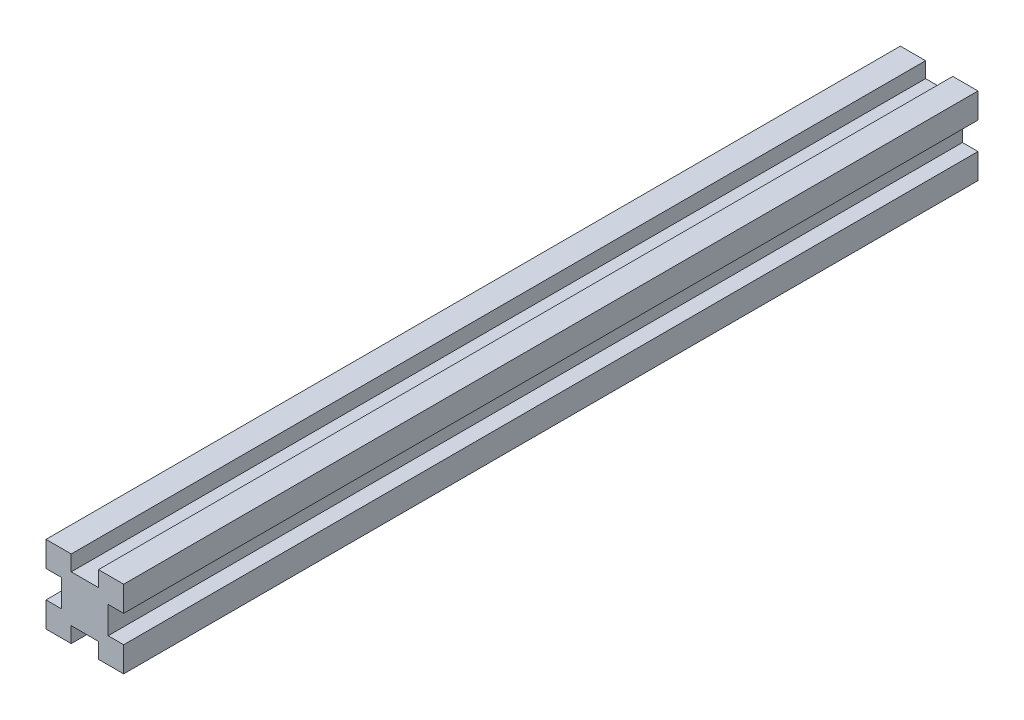
ISO-10303-21;
HEADER;
FILE_DESCRIPTION(('STEP AP214'),'2;1');
FILE_NAME('part.step','',(''),(''),'','','');
FILE_SCHEMA(('AUTOMOTIVE_DESIGN { 1 0 10303 214 1 1 1 1 }'));
ENDSEC;
DATA;
#1=APPLICATION_CONTEXT('core data for automotive mechanical design processes');
#2=APPLICATION_PROTOCOL_DEFINITION('international standard','automotive_design',2000,#1);
#3=PRODUCT_CONTEXT('',#1,'mechanical');
#4=PRODUCT('Part','Part','',(#3));
#5=PRODUCT_RELATED_PRODUCT_CATEGORY('part','',(#4));
#6=PRODUCT_DEFINITION_FORMATION('','',#4);
#7=PRODUCT_DEFINITION_CONTEXT('part definition',#1,'design');
#8=PRODUCT_DEFINITION('design','',#6,#7);
#9=PRODUCT_DEFINITION_SHAPE('','',#8);
#10=(LENGTH_UNIT() NAMED_UNIT(*) SI_UNIT(.MILLI.,.METRE.));
#11=(NAMED_UNIT(*) PLANE_ANGLE_UNIT() SI_UNIT($,.RADIAN.));
#12=(NAMED_UNIT(*) SI_UNIT($,.STERADIAN.) SOLID_ANGLE_UNIT());
#13=UNCERTAINTY_MEASURE_WITH_UNIT(LENGTH_MEASURE(1.E-05),#10,'distance_accuracy_value','');
#14=(GEOMETRIC_REPRESENTATION_CONTEXT(3) GLOBAL_UNCERTAINTY_ASSIGNED_CONTEXT((#13)) GLOBAL_UNIT_ASSIGNED_CONTEXT((#10,
#11,#12)) REPRESENTATION_CONTEXT('',''));
#15=CARTESIAN_POINT('',(0.,0.,0.));
#16=DIRECTION('',(0.,0.,1.));
#17=DIRECTION('',(1.,0.,0.));
#18=AXIS2_PLACEMENT_3D('',#15,#16,#17);
#19=CARTESIAN_POINT('',(0.,0.,0.));
#20=DIRECTION('',(0.,0.,1.));
#21=DIRECTION('',(1.,0.,0.));
#22=AXIS2_PLACEMENT_3D('',#19,#20,#21);
#23=PLANE('',#22);
#24=DIRECTION('',(1.,0.,0.));
#25=VECTOR('',#24,1.);
#26=CARTESIAN_POINT('',(0.,-3.50000000000081,0.));
#27=LINE('',#26,#25);
#28=CARTESIAN_POINT('',(-10.,-3.50000000000081,0.));
#29=VERTEX_POINT('',#28);
#30=CARTESIAN_POINT('',(-5.99999999999979,-3.50000000000081,0.));
#31=VERTEX_POINT('',#30);
#32=EDGE_CURVE('E286',#29,#31,#27,.T.);
#33=ORIENTED_EDGE('',*,*,#32,.T.);
#34=DIRECTION('',(0.,1.,0.));
#35=VECTOR('',#34,1.);
#36=CARTESIAN_POINT('',(-5.99999999999979,0.,0.));
#37=LINE('',#36,#35);
#38=CARTESIAN_POINT('',(-5.99999999999979,3.49999999999919,0.));
#39=VERTEX_POINT('',#38);
#40=EDGE_CURVE('E11',#31,#39,#37,.T.);
#41=ORIENTED_EDGE('',*,*,#40,.T.);
#42=DIRECTION('',(1.,0.,0.));
#43=VECTOR('',#42,1.);
#44=CARTESIAN_POINT('',(0.,3.4999999999992,0.));
#45=LINE('',#44,#43);
#46=CARTESIAN_POINT('',(-10.,3.49999999999919,0.));
#47=VERTEX_POINT('',#46);
#48=EDGE_CURVE('E369',#47,#39,#45,.T.);
#49=ORIENTED_EDGE('',*,*,#48,.F.);
#50=DIRECTION('',(0.,-1.,0.));
#51=VECTOR('',#50,1.);
#52=CARTESIAN_POINT('',(-10.,0.,0.));
#53=LINE('',#52,#51);
#54=CARTESIAN_POINT('',(-10.,10.,0.));
#55=VERTEX_POINT('',#54);
#56=EDGE_CURVE('E205',#55,#47,#53,.T.);
#57=ORIENTED_EDGE('',*,*,#56,.F.);
#58=DIRECTION('',(1.,0.,0.));
#59=VECTOR('',#58,1.);
#60=CARTESIAN_POINT('',(0.,10.,0.));
#61=LINE('',#60,#59);
#62=CARTESIAN_POINT('',(-3.5,10.,0.));
#63=VERTEX_POINT('',#62);
#64=EDGE_CURVE('E206',#55,#63,#61,.T.);
#65=ORIENTED_EDGE('',*,*,#64,.T.);
#66=DIRECTION('',(0.,-1.,0.));
#67=VECTOR('',#66,1.);
#68=CARTESIAN_POINT('',(-3.5,0.,0.));
#69=LINE('',#68,#67);
#70=CARTESIAN_POINT('',(-3.5,6.,0.));
#71=VERTEX_POINT('',#70);
#72=EDGE_CURVE('E169',#63,#71,#69,.T.);
#73=ORIENTED_EDGE('',*,*,#72,.T.);
#74=DIRECTION('',(1.,0.,0.));
#75=VECTOR('',#74,1.);
#76=CARTESIAN_POINT('',(0.,6.,0.));
#77=LINE('',#76,#75);
#78=CARTESIAN_POINT('',(3.5,6.,0.));
#79=VERTEX_POINT('',#78);
#80=EDGE_CURVE('E170',#71,#79,#77,.T.);
#81=ORIENTED_EDGE('',*,*,#80,.T.);
#82=DIRECTION('',(0.,-1.,0.));
#83=VECTOR('',#82,1.);
#84=CARTESIAN_POINT('',(3.5,0.,0.));
#85=LINE('',#84,#83);
#86=CARTESIAN_POINT('',(3.5,10.,0.));
#87=VERTEX_POINT('',#86);
#88=EDGE_CURVE('E233',#87,#79,#85,.T.);
#89=ORIENTED_EDGE('',*,*,#88,.F.);
#90=DIRECTION('',(1.,0.,0.));
#91=VECTOR('',#90,1.);
#92=CARTESIAN_POINT('',(0.,10.,0.));
#93=LINE('',#92,#91);
#94=CARTESIAN_POINT('',(10.,10.,0.));
#95=VERTEX_POINT('',#94);
#96=EDGE_CURVE('E234',#87,#95,#93,.T.);
#97=ORIENTED_EDGE('',*,*,#96,.T.);
#98=DIRECTION('',(0.,-1.,0.));
#99=VECTOR('',#98,1.);
#100=CARTESIAN_POINT('',(10.,0.,0.));
#101=LINE('',#100,#99);
#102=CARTESIAN_POINT('',(10.,3.50000000000021,0.));
#103=VERTEX_POINT('',#102);
#104=EDGE_CURVE('E201',#95,#103,#101,.T.);
#105=ORIENTED_EDGE('',*,*,#104,.T.);
#106=DIRECTION('',(-1.,0.,0.));
#107=VECTOR('',#106,1.);
#108=CARTESIAN_POINT('',(0.,3.50000000000021,0.));
#109=LINE('',#108,#107);
#110=CARTESIAN_POINT('',(6.00000000000081,3.50000000000021,0.));
#111=VERTEX_POINT('',#110);
#112=EDGE_CURVE('E184',#103,#111,#109,.T.);
#113=ORIENTED_EDGE('',*,*,#112,.T.);
#114=DIRECTION('',(0.,-1.,0.));
#115=VECTOR('',#114,1.);
#116=CARTESIAN_POINT('',(6.00000000000081,0.,0.));
#117=LINE('',#116,#115);
#118=CARTESIAN_POINT('',(6.00000000000081,-3.49999999999979,0.));
#119=VERTEX_POINT('',#118);
#120=EDGE_CURVE('E172',#111,#119,#117,.T.);
#121=ORIENTED_EDGE('',*,*,#120,.T.);
#122=DIRECTION('',(-1.,0.,0.));
#123=VECTOR('',#122,1.);
#124=CARTESIAN_POINT('',(0.,-3.4999999999998,0.));
#125=LINE('',#124,#123);
#126=CARTESIAN_POINT('',(10.0000000000008,-3.49999999999979,0.));
#127=VERTEX_POINT('',#126);
#128=EDGE_CURVE('E187',#127,#119,#125,.T.);
#129=ORIENTED_EDGE('',*,*,#128,.F.);
#130=DIRECTION('',(0.,-1.,0.));
#131=VECTOR('',#130,1.);
#132=CARTESIAN_POINT('',(10.,0.,0.));
#133=LINE('',#132,#131);
#134=CARTESIAN_POINT('',(10.,-10.,0.));
#135=VERTEX_POINT('',#134);
#136=EDGE_CURVE('E133',#127,#135,#133,.T.);
#137=ORIENTED_EDGE('',*,*,#136,.T.);
#138=DIRECTION('',(1.,0.,0.));
#139=VECTOR('',#138,1.);
#140=CARTESIAN_POINT('',(0.,-10.,0.));
#141=LINE('',#140,#139);
#142=CARTESIAN_POINT('',(3.50000000000102,-10.,0.));
#143=VERTEX_POINT('',#142);
#144=EDGE_CURVE('E127',#143,#135,#141,.T.);
#145=ORIENTED_EDGE('',*,*,#144,.F.);
#146=DIRECTION('',(0.,1.,0.));
#147=VECTOR('',#146,1.);
#148=CARTESIAN_POINT('',(3.50000000000102,0.,0.));
#149=LINE('',#148,#147);
#150=CARTESIAN_POINT('',(3.50000000000102,-6.00000000000061,0.));
#151=VERTEX_POINT('',#150);
#152=EDGE_CURVE('E130',#143,#151,#149,.T.);
#153=ORIENTED_EDGE('',*,*,#152,.T.);
#154=DIRECTION('',(-1.,0.,0.));
#155=VECTOR('',#154,1.);
#156=CARTESIAN_POINT('',(0.,-6.00000000000061,0.));
#157=LINE('',#156,#155);
#158=CARTESIAN_POINT('',(-3.49999999999898,-6.00000000000061,0.));
#159=VERTEX_POINT('',#158);
#160=EDGE_CURVE('E93',#151,#159,#157,.T.);
#161=ORIENTED_EDGE('',*,*,#160,.T.);
#162=DIRECTION('',(0.,1.,0.));
#163=VECTOR('',#162,1.);
#164=CARTESIAN_POINT('',(-3.49999999999899,0.,0.));
#165=LINE('',#164,#163);
#166=CARTESIAN_POINT('',(-3.49999999999898,-10.,0.));
#167=VERTEX_POINT('',#166);
#168=EDGE_CURVE('E105',#167,#159,#165,.T.);
#169=ORIENTED_EDGE('',*,*,#168,.F.);
#170=DIRECTION('',(1.,0.,0.));
#171=VECTOR('',#170,1.);
#172=CARTESIAN_POINT('',(0.,-10.,0.));
#173=LINE('',#172,#171);
#174=CARTESIAN_POINT('',(-10.,-10.,0.));
#175=VERTEX_POINT('',#174);
#176=EDGE_CURVE('E253',#175,#167,#173,.T.);
#177=ORIENTED_EDGE('',*,*,#176,.F.);
#178=DIRECTION('',(0.,-1.,0.));
#179=VECTOR('',#178,1.);
#180=CARTESIAN_POINT('',(-10.,0.,0.));
#181=LINE('',#180,#179);
#182=EDGE_CURVE('E40',#29,#175,#181,.T.);
#183=ORIENTED_EDGE('',*,*,#182,.F.);
#184=EDGE_LOOP('',(#33,#41,#49,#57,#65,#73,#81,#89,#97,#105,#113,#121,#129,#137,#145,#153,#161,
#169,#177,#183));
#185=FACE_BOUND('',#184,.T.);
#186=ADVANCED_FACE('F36',(#185),#23,.F.);
#187=CARTESIAN_POINT('',(-5.99999999999979,0.,50.));
#188=DIRECTION('',(-1.,0.,0.));
#189=DIRECTION('',(0.,1.,0.));
#190=AXIS2_PLACEMENT_3D('',#187,#188,#189);
#191=PLANE('',#190);
#192=ORIENTED_EDGE('',*,*,#40,.F.);
#193=DIRECTION('',(0.,0.,-1.));
#194=VECTOR('',#193,1.);
#195=CARTESIAN_POINT('',(-5.99999999999979,-3.50000000000081,50.));
#196=LINE('',#195,#194);
#197=CARTESIAN_POINT('',(-5.99999999999979,-3.50000000000081,220.));
#198=VERTEX_POINT('',#197);
#199=EDGE_CURVE('E274',#198,#31,#196,.T.);
#200=ORIENTED_EDGE('',*,*,#199,.F.);
#201=DIRECTION('',(0.,-1.,0.));
#202=VECTOR('',#201,1.);
#203=CARTESIAN_POINT('',(-5.99999999999979,-3.50000000000081,220.));
#204=LINE('',#203,#202);
#205=CARTESIAN_POINT('',(-5.99999999999979,3.49999999999919,220.));
#206=VERTEX_POINT('',#205);
#207=EDGE_CURVE('E390',#206,#198,#204,.T.);
#208=ORIENTED_EDGE('',*,*,#207,.F.);
#209=DIRECTION('',(0.,0.,-1.));
#210=VECTOR('',#209,1.);
#211=CARTESIAN_POINT('',(-5.99999999999979,3.49999999999919,50.));
#212=LINE('',#211,#210);
#213=EDGE_CURVE('E47',#206,#39,#212,.T.);
#214=ORIENTED_EDGE('',*,*,#213,.T.);
#215=EDGE_LOOP('',(#192,#200,#208,#214));
#216=FACE_BOUND('',#215,.T.);
#217=ADVANCED_FACE('F326',(#216),#191,.T.);
#218=CARTESIAN_POINT('',(0.,3.4999999999992,50.));
#219=DIRECTION('',(0.,1.,0.));
#220=DIRECTION('',(1.,0.,0.));
#221=AXIS2_PLACEMENT_3D('',#218,#219,#220);
#222=PLANE('',#221);
#223=ORIENTED_EDGE('',*,*,#48,.T.);
#224=ORIENTED_EDGE('',*,*,#213,.F.);
#225=DIRECTION('',(1.,0.,0.));
#226=VECTOR('',#225,1.);
#227=CARTESIAN_POINT('',(-10.,3.49999999999919,220.));
#228=LINE('',#227,#226);
#229=CARTESIAN_POINT('',(-10.,3.49999999999919,220.));
#230=VERTEX_POINT('',#229);
#231=EDGE_CURVE('E380',#230,#206,#228,.T.);
#232=ORIENTED_EDGE('',*,*,#231,.F.);
#233=DIRECTION('',(0.,0.,-1.));
#234=VECTOR('',#233,1.);
#235=CARTESIAN_POINT('',(-10.,3.49999999999919,50.));
#236=LINE('',#235,#234);
#237=EDGE_CURVE('E210',#230,#47,#236,.T.);
#238=ORIENTED_EDGE('',*,*,#237,.T.);
#239=EDGE_LOOP('',(#223,#224,#232,#238));
#240=FACE_BOUND('',#239,.T.);
#241=ADVANCED_FACE('F331',(#240),#222,.F.);
#242=CARTESIAN_POINT('',(-10.,0.,50.));
#243=DIRECTION('',(1.,0.,0.));
#244=DIRECTION('',(0.,1.,0.));
#245=AXIS2_PLACEMENT_3D('',#242,#243,#244);
#246=PLANE('',#245);
#247=ORIENTED_EDGE('',*,*,#56,.T.);
#248=ORIENTED_EDGE('',*,*,#237,.F.);
#249=DIRECTION('',(0.,-1.,0.));
#250=VECTOR('',#249,1.);
#251=CARTESIAN_POINT('',(-10.,10.,220.));
#252=LINE('',#251,#250);
#253=CARTESIAN_POINT('',(-10.,10.,220.));
#254=VERTEX_POINT('',#253);
#255=EDGE_CURVE('E373',#254,#230,#252,.T.);
#256=ORIENTED_EDGE('',*,*,#255,.F.);
#257=DIRECTION('',(0.,0.,-1.));
#258=VECTOR('',#257,1.);
#259=CARTESIAN_POINT('',(-10.,10.,50.));
#260=LINE('',#259,#258);
#261=EDGE_CURVE('E202',#254,#55,#260,.T.);
#262=ORIENTED_EDGE('',*,*,#261,.T.);
#263=EDGE_LOOP('',(#247,#248,#256,#262));
#264=FACE_BOUND('',#263,.T.);
#265=ADVANCED_FACE('F350',(#264),#246,.F.);
#266=CARTESIAN_POINT('',(0.,10.,50.));
#267=DIRECTION('',(0.,1.,0.));
#268=DIRECTION('',(1.,0.,0.));
#269=AXIS2_PLACEMENT_3D('',#266,#267,#268);
#270=PLANE('',#269);
#271=ORIENTED_EDGE('',*,*,#64,.F.);
#272=ORIENTED_EDGE('',*,*,#261,.F.);
#273=DIRECTION('',(-1.,0.,0.));
#274=VECTOR('',#273,1.);
#275=CARTESIAN_POINT('',(-10.,10.,220.));
#276=LINE('',#275,#274);
#277=CARTESIAN_POINT('',(-3.5,10.,220.));
#278=VERTEX_POINT('',#277);
#279=EDGE_CURVE('E381',#278,#254,#276,.T.);
#280=ORIENTED_EDGE('',*,*,#279,.F.);
#281=DIRECTION('',(0.,0.,-1.));
#282=VECTOR('',#281,1.);
#283=CARTESIAN_POINT('',(-3.5,10.,50.));
#284=LINE('',#283,#282);
#285=EDGE_CURVE('E215',#278,#63,#284,.T.);
#286=ORIENTED_EDGE('',*,*,#285,.T.);
#287=EDGE_LOOP('',(#271,#272,#280,#286));
#288=FACE_BOUND('',#287,.T.);
#289=ADVANCED_FACE('F347',(#288),#270,.T.);
#290=CARTESIAN_POINT('',(-3.5,0.,50.));
#291=DIRECTION('',(1.,0.,0.));
#292=DIRECTION('',(0.,-1.,0.));
#293=AXIS2_PLACEMENT_3D('',#290,#291,#292);
#294=PLANE('',#293);
#295=ORIENTED_EDGE('',*,*,#72,.F.);
#296=ORIENTED_EDGE('',*,*,#285,.F.);
#297=DIRECTION('',(0.,1.,0.));
#298=VECTOR('',#297,1.);
#299=CARTESIAN_POINT('',(-3.5,10.,220.));
#300=LINE('',#299,#298);
#301=CARTESIAN_POINT('',(-3.5,6.,220.));
#302=VERTEX_POINT('',#301);
#303=EDGE_CURVE('E295',#302,#278,#300,.T.);
#304=ORIENTED_EDGE('',*,*,#303,.F.);
#305=DIRECTION('',(0.,0.,-1.));
#306=VECTOR('',#305,1.);
#307=CARTESIAN_POINT('',(-3.5,6.,50.));
#308=LINE('',#307,#306);
#309=EDGE_CURVE('E166',#302,#71,#308,.T.);
#310=ORIENTED_EDGE('',*,*,#309,.T.);
#311=EDGE_LOOP('',(#295,#296,#304,#310));
#312=FACE_BOUND('',#311,.T.);
#313=ADVANCED_FACE('F349',(#312),#294,.T.);
#314=CARTESIAN_POINT('',(0.,6.,50.));
#315=DIRECTION('',(0.,1.,0.));
#316=DIRECTION('',(1.,0.,0.));
#317=AXIS2_PLACEMENT_3D('',#314,#315,#316);
#318=PLANE('',#317);
#319=ORIENTED_EDGE('',*,*,#80,.F.);
#320=ORIENTED_EDGE('',*,*,#309,.F.);
#321=DIRECTION('',(-1.,0.,0.));
#322=VECTOR('',#321,1.);
#323=CARTESIAN_POINT('',(-3.5,6.,220.));
#324=LINE('',#323,#322);
#325=CARTESIAN_POINT('',(3.5,6.,220.));
#326=VERTEX_POINT('',#325);
#327=EDGE_CURVE('E429',#326,#302,#324,.T.);
#328=ORIENTED_EDGE('',*,*,#327,.F.);
#329=DIRECTION('',(0.,0.,-1.));
#330=VECTOR('',#329,1.);
#331=CARTESIAN_POINT('',(3.5,6.,50.));
#332=LINE('',#331,#330);
#333=EDGE_CURVE('E244',#326,#79,#332,.T.);
#334=ORIENTED_EDGE('',*,*,#333,.T.);
#335=EDGE_LOOP('',(#319,#320,#328,#334));
#336=FACE_BOUND('',#335,.T.);
#337=ADVANCED_FACE('F356',(#336),#318,.T.);
#338=CARTESIAN_POINT('',(3.5,0.,50.));
#339=DIRECTION('',(1.,0.,0.));
#340=DIRECTION('',(0.,1.,0.));
#341=AXIS2_PLACEMENT_3D('',#338,#339,#340);
#342=PLANE('',#341);
#343=ORIENTED_EDGE('',*,*,#88,.T.);
#344=ORIENTED_EDGE('',*,*,#333,.F.);
#345=DIRECTION('',(0.,-1.,0.));
#346=VECTOR('',#345,1.);
#347=CARTESIAN_POINT('',(3.5,10.,220.));
#348=LINE('',#347,#346);
#349=CARTESIAN_POINT('',(3.5,10.,220.));
#350=VERTEX_POINT('',#349);
#351=EDGE_CURVE('E426',#350,#326,#348,.T.);
#352=ORIENTED_EDGE('',*,*,#351,.F.);
#353=DIRECTION('',(0.,0.,-1.));
#354=VECTOR('',#353,1.);
#355=CARTESIAN_POINT('',(3.5,10.,50.));
#356=LINE('',#355,#354);
#357=EDGE_CURVE('E229',#350,#87,#356,.T.);
#358=ORIENTED_EDGE('',*,*,#357,.T.);
#359=EDGE_LOOP('',(#343,#344,#352,#358));
#360=FACE_BOUND('',#359,.T.);
#361=ADVANCED_FACE('F322',(#360),#342,.F.);
#362=CARTESIAN_POINT('',(0.,10.,50.));
#363=DIRECTION('',(0.,1.,0.));
#364=DIRECTION('',(1.,0.,0.));
#365=AXIS2_PLACEMENT_3D('',#362,#363,#364);
#366=PLANE('',#365);
#367=ORIENTED_EDGE('',*,*,#96,.F.);
#368=ORIENTED_EDGE('',*,*,#357,.F.);
#369=DIRECTION('',(-1.,0.,0.));
#370=VECTOR('',#369,1.);
#371=CARTESIAN_POINT('',(3.5,10.,220.));
#372=LINE('',#371,#370);
#373=CARTESIAN_POINT('',(10.,10.,220.));
#374=VERTEX_POINT('',#373);
#375=EDGE_CURVE('E309',#374,#350,#372,.T.);
#376=ORIENTED_EDGE('',*,*,#375,.F.);
#377=DIRECTION('',(0.,0.,-1.));
#378=VECTOR('',#377,1.);
#379=CARTESIAN_POINT('',(10.,10.,50.));
#380=LINE('',#379,#378);
#381=EDGE_CURVE('E164',#374,#95,#380,.T.);
#382=ORIENTED_EDGE('',*,*,#381,.T.);
#383=EDGE_LOOP('',(#367,#368,#376,#382));
#384=FACE_BOUND('',#383,.T.);
#385=ADVANCED_FACE('F38',(#384),#366,.T.);
#386=CARTESIAN_POINT('',(10.,0.,50.));
#387=DIRECTION('',(1.,0.,0.));
#388=DIRECTION('',(0.,1.,0.));
#389=AXIS2_PLACEMENT_3D('',#386,#387,#388);
#390=PLANE('',#389);
#391=ORIENTED_EDGE('',*,*,#104,.F.);
#392=ORIENTED_EDGE('',*,*,#381,.F.);
#393=DIRECTION('',(0.,1.,0.));
#394=VECTOR('',#393,1.);
#395=CARTESIAN_POINT('',(10.,10.,220.));
#396=LINE('',#395,#394);
#397=CARTESIAN_POINT('',(10.,3.50000000000021,220.));
#398=VERTEX_POINT('',#397);
#399=EDGE_CURVE('E423',#398,#374,#396,.T.);
#400=ORIENTED_EDGE('',*,*,#399,.F.);
#401=DIRECTION('',(0.,0.,-1.));
#402=VECTOR('',#401,1.);
#403=CARTESIAN_POINT('',(10.,3.50000000000021,50.));
#404=LINE('',#403,#402);
#405=EDGE_CURVE('E213',#398,#103,#404,.T.);
#406=ORIENTED_EDGE('',*,*,#405,.T.);
#407=EDGE_LOOP('',(#391,#392,#400,#406));
#408=FACE_BOUND('',#407,.T.);
#409=ADVANCED_FACE('F311',(#408),#390,.T.);
#410=CARTESIAN_POINT('',(0.,3.50000000000021,50.));
#411=DIRECTION('',(0.,-1.,0.));
#412=DIRECTION('',(0.,0.,-1.));
#413=AXIS2_PLACEMENT_3D('',#410,#411,#412);
#414=PLANE('',#413);
#415=ORIENTED_EDGE('',*,*,#112,.F.);
#416=ORIENTED_EDGE('',*,*,#405,.F.);
#417=DIRECTION('',(1.,0.,0.));
#418=VECTOR('',#417,1.);
#419=CARTESIAN_POINT('',(10.,3.50000000000021,220.));
#420=LINE('',#419,#418);
#421=CARTESIAN_POINT('',(6.00000000000081,3.50000000000021,220.));
#422=VERTEX_POINT('',#421);
#423=EDGE_CURVE('E420',#422,#398,#420,.T.);
#424=ORIENTED_EDGE('',*,*,#423,.F.);
#425=DIRECTION('',(0.,0.,-1.));
#426=VECTOR('',#425,1.);
#427=CARTESIAN_POINT('',(6.00000000000081,3.50000000000021,50.));
#428=LINE('',#427,#426);
#429=EDGE_CURVE('E175',#422,#111,#428,.T.);
#430=ORIENTED_EDGE('',*,*,#429,.T.);
#431=EDGE_LOOP('',(#415,#416,#424,#430));
#432=FACE_BOUND('',#431,.T.);
#433=ADVANCED_FACE('F313',(#432),#414,.T.);
#434=CARTESIAN_POINT('',(6.00000000000081,0.,50.));
#435=DIRECTION('',(1.,0.,0.));
#436=DIRECTION('',(0.,-1.,0.));
#437=AXIS2_PLACEMENT_3D('',#434,#435,#436);
#438=PLANE('',#437);
#439=ORIENTED_EDGE('',*,*,#120,.F.);
#440=ORIENTED_EDGE('',*,*,#429,.F.);
#441=DIRECTION('',(0.,1.,0.));
#442=VECTOR('',#441,1.);
#443=CARTESIAN_POINT('',(6.00000000000081,3.50000000000021,220.));
#444=LINE('',#443,#442);
#445=CARTESIAN_POINT('',(6.00000000000081,-3.49999999999979,220.));
#446=VERTEX_POINT('',#445);
#447=EDGE_CURVE('E417',#446,#422,#444,.T.);
#448=ORIENTED_EDGE('',*,*,#447,.F.);
#449=DIRECTION('',(0.,0.,-1.));
#450=VECTOR('',#449,1.);
#451=CARTESIAN_POINT('',(6.00000000000081,-3.49999999999979,50.));
#452=LINE('',#451,#450);
#453=EDGE_CURVE('E176',#446,#119,#452,.T.);
#454=ORIENTED_EDGE('',*,*,#453,.T.);
#455=EDGE_LOOP('',(#439,#440,#448,#454));
#456=FACE_BOUND('',#455,.T.);
#457=ADVANCED_FACE('F319',(#456),#438,.T.);
#458=CARTESIAN_POINT('',(0.,-3.4999999999998,50.));
#459=DIRECTION('',(0.,-1.,0.));
#460=DIRECTION('',(0.,0.,-1.));
#461=AXIS2_PLACEMENT_3D('',#458,#459,#460);
#462=PLANE('',#461);
#463=ORIENTED_EDGE('',*,*,#128,.T.);
#464=ORIENTED_EDGE('',*,*,#453,.F.);
#465=DIRECTION('',(-1.,0.,0.));
#466=VECTOR('',#465,1.);
#467=CARTESIAN_POINT('',(10.0000000000008,-3.49999999999979,220.));
#468=LINE('',#467,#466);
#469=CARTESIAN_POINT('',(10.0000000000008,-3.49999999999979,220.));
#470=VERTEX_POINT('',#469);
#471=EDGE_CURVE('E414',#470,#446,#468,.T.);
#472=ORIENTED_EDGE('',*,*,#471,.F.);
#473=DIRECTION('',(0.,0.,-1.));
#474=VECTOR('',#473,1.);
#475=CARTESIAN_POINT('',(10.0000000000008,-3.49999999999979,50.));
#476=LINE('',#475,#474);
#477=EDGE_CURVE('E197',#470,#127,#476,.T.);
#478=ORIENTED_EDGE('',*,*,#477,.T.);
#479=EDGE_LOOP('',(#463,#464,#472,#478));
#480=FACE_BOUND('',#479,.T.);
#481=ADVANCED_FACE('F471',(#480),#462,.F.);
#482=CARTESIAN_POINT('',(10.,0.,50.));
#483=DIRECTION('',(1.,0.,0.));
#484=DIRECTION('',(0.,1.,0.));
#485=AXIS2_PLACEMENT_3D('',#482,#483,#484);
#486=PLANE('',#485);
#487=ORIENTED_EDGE('',*,*,#136,.F.);
#488=ORIENTED_EDGE('',*,*,#477,.F.);
#489=DIRECTION('',(1.23031926526966E-13,1.,0.));
#490=VECTOR('',#489,1.);
#491=CARTESIAN_POINT('',(10.0000000000008,-3.49999999999979,220.));
#492=LINE('',#491,#490);
#493=CARTESIAN_POINT('',(10.,-10.,220.));
#494=VERTEX_POINT('',#493);
#495=EDGE_CURVE('E411',#494,#470,#492,.T.);
#496=ORIENTED_EDGE('',*,*,#495,.F.);
#497=DIRECTION('',(0.,0.,-1.));
#498=VECTOR('',#497,1.);
#499=CARTESIAN_POINT('',(10.,-10.,50.));
#500=LINE('',#499,#498);
#501=EDGE_CURVE('E138',#494,#135,#500,.T.);
#502=ORIENTED_EDGE('',*,*,#501,.T.);
#503=EDGE_LOOP('',(#487,#488,#496,#502));
#504=FACE_BOUND('',#503,.T.);
#505=ADVANCED_FACE('F476',(#504),#486,.T.);
#506=CARTESIAN_POINT('',(0.,-10.,50.));
#507=DIRECTION('',(0.,1.,0.));
#508=DIRECTION('',(1.,0.,0.));
#509=AXIS2_PLACEMENT_3D('',#506,#507,#508);
#510=PLANE('',#509);
#511=ORIENTED_EDGE('',*,*,#144,.T.);
#512=ORIENTED_EDGE('',*,*,#501,.F.);
#513=DIRECTION('',(1.,0.,0.));
#514=VECTOR('',#513,1.);
#515=CARTESIAN_POINT('',(3.50000000000102,-10.,220.));
#516=LINE('',#515,#514);
#517=CARTESIAN_POINT('',(3.50000000000102,-10.,220.));
#518=VERTEX_POINT('',#517);
#519=EDGE_CURVE('E146',#518,#494,#516,.T.);
#520=ORIENTED_EDGE('',*,*,#519,.F.);
#521=DIRECTION('',(0.,0.,-1.));
#522=VECTOR('',#521,1.);
#523=CARTESIAN_POINT('',(3.50000000000102,-10.,50.));
#524=LINE('',#523,#522);
#525=EDGE_CURVE('E139',#518,#143,#524,.T.);
#526=ORIENTED_EDGE('',*,*,#525,.T.);
#527=EDGE_LOOP('',(#511,#512,#520,#526));
#528=FACE_BOUND('',#527,.T.);
#529=ADVANCED_FACE('F143',(#528),#510,.F.);
#530=CARTESIAN_POINT('',(3.50000000000102,0.,50.));
#531=DIRECTION('',(-1.,0.,0.));
#532=DIRECTION('',(0.,1.,0.));
#533=AXIS2_PLACEMENT_3D('',#530,#531,#532);
#534=PLANE('',#533);
#535=ORIENTED_EDGE('',*,*,#152,.F.);
#536=ORIENTED_EDGE('',*,*,#525,.F.);
#537=DIRECTION('',(0.,-1.,0.));
#538=VECTOR('',#537,1.);
#539=CARTESIAN_POINT('',(3.50000000000102,-10.,220.));
#540=LINE('',#539,#538);
#541=CARTESIAN_POINT('',(3.50000000000102,-6.00000000000061,220.));
#542=VERTEX_POINT('',#541);
#543=EDGE_CURVE('E408',#542,#518,#540,.T.);
#544=ORIENTED_EDGE('',*,*,#543,.F.);
#545=DIRECTION('',(0.,0.,-1.));
#546=VECTOR('',#545,1.);
#547=CARTESIAN_POINT('',(3.50000000000102,-6.00000000000061,50.));
#548=LINE('',#547,#546);
#549=EDGE_CURVE('E154',#542,#151,#548,.T.);
#550=ORIENTED_EDGE('',*,*,#549,.T.);
#551=EDGE_LOOP('',(#535,#536,#544,#550));
#552=FACE_BOUND('',#551,.T.);
#553=ADVANCED_FACE('F152',(#552),#534,.T.);
#554=CARTESIAN_POINT('',(0.,-6.00000000000061,50.));
#555=DIRECTION('',(0.,-1.,0.));
#556=DIRECTION('',(-1.,0.,0.));
#557=AXIS2_PLACEMENT_3D('',#554,#555,#556);
#558=PLANE('',#557);
#559=ORIENTED_EDGE('',*,*,#160,.F.);
#560=ORIENTED_EDGE('',*,*,#549,.F.);
#561=DIRECTION('',(1.,0.,0.));
#562=VECTOR('',#561,1.);
#563=CARTESIAN_POINT('',(3.50000000000102,-6.00000000000061,220.));
#564=LINE('',#563,#562);
#565=CARTESIAN_POINT('',(-3.49999999999898,-6.00000000000061,220.));
#566=VERTEX_POINT('',#565);
#567=EDGE_CURVE('E405',#566,#542,#564,.T.);
#568=ORIENTED_EDGE('',*,*,#567,.F.);
#569=DIRECTION('',(0.,0.,-1.));
#570=VECTOR('',#569,1.);
#571=CARTESIAN_POINT('',(-3.49999999999898,-6.00000000000061,50.));
#572=LINE('',#571,#570);
#573=EDGE_CURVE('E238',#566,#159,#572,.T.);
#574=ORIENTED_EDGE('',*,*,#573,.T.);
#575=EDGE_LOOP('',(#559,#560,#568,#574));
#576=FACE_BOUND('',#575,.T.);
#577=ADVANCED_FACE('F481',(#576),#558,.T.);
#578=CARTESIAN_POINT('',(-3.49999999999899,0.,50.));
#579=DIRECTION('',(-1.,0.,0.));
#580=DIRECTION('',(0.,1.,0.));
#581=AXIS2_PLACEMENT_3D('',#578,#579,#580);
#582=PLANE('',#581);
#583=ORIENTED_EDGE('',*,*,#168,.T.);
#584=ORIENTED_EDGE('',*,*,#573,.F.);
#585=DIRECTION('',(0.,1.,0.));
#586=VECTOR('',#585,1.);
#587=CARTESIAN_POINT('',(-3.49999999999898,-10.,220.));
#588=LINE('',#587,#586);
#589=CARTESIAN_POINT('',(-3.49999999999898,-10.,220.));
#590=VERTEX_POINT('',#589);
#591=EDGE_CURVE('E402',#590,#566,#588,.T.);
#592=ORIENTED_EDGE('',*,*,#591,.F.);
#593=DIRECTION('',(0.,0.,-1.));
#594=VECTOR('',#593,1.);
#595=CARTESIAN_POINT('',(-3.49999999999898,-10.,50.));
#596=LINE('',#595,#594);
#597=EDGE_CURVE('E250',#590,#167,#596,.T.);
#598=ORIENTED_EDGE('',*,*,#597,.T.);
#599=EDGE_LOOP('',(#583,#584,#592,#598));
#600=FACE_BOUND('',#599,.T.);
#601=ADVANCED_FACE('F345',(#600),#582,.F.);
#602=CARTESIAN_POINT('',(0.,-10.,50.));
#603=DIRECTION('',(0.,1.,0.));
#604=DIRECTION('',(1.,0.,0.));
#605=AXIS2_PLACEMENT_3D('',#602,#603,#604);
#606=PLANE('',#605);
#607=ORIENTED_EDGE('',*,*,#176,.T.);
#608=ORIENTED_EDGE('',*,*,#597,.F.);
#609=DIRECTION('',(1.,0.,0.));
#610=VECTOR('',#609,1.);
#611=CARTESIAN_POINT('',(-10.,-10.,220.));
#612=LINE('',#611,#610);
#613=CARTESIAN_POINT('',(-10.,-10.,220.));
#614=VERTEX_POINT('',#613);
#615=EDGE_CURVE('E399',#614,#590,#612,.T.);
#616=ORIENTED_EDGE('',*,*,#615,.F.);
#617=DIRECTION('',(0.,0.,-1.));
#618=VECTOR('',#617,1.);
#619=CARTESIAN_POINT('',(-10.,-10.,50.));
#620=LINE('',#619,#618);
#621=EDGE_CURVE('E272',#614,#175,#620,.T.);
#622=ORIENTED_EDGE('',*,*,#621,.T.);
#623=EDGE_LOOP('',(#607,#608,#616,#622));
#624=FACE_BOUND('',#623,.T.);
#625=ADVANCED_FACE('F340',(#624),#606,.F.);
#626=CARTESIAN_POINT('',(-10.,0.,50.));
#627=DIRECTION('',(1.,0.,0.));
#628=DIRECTION('',(0.,1.,0.));
#629=AXIS2_PLACEMENT_3D('',#626,#627,#628);
#630=PLANE('',#629);
#631=ORIENTED_EDGE('',*,*,#182,.T.);
#632=ORIENTED_EDGE('',*,*,#621,.F.);
#633=DIRECTION('',(0.,-1.,0.));
#634=VECTOR('',#633,1.);
#635=CARTESIAN_POINT('',(-10.,-3.50000000000081,220.));
#636=LINE('',#635,#634);
#637=CARTESIAN_POINT('',(-10.,-3.50000000000081,220.));
#638=VERTEX_POINT('',#637);
#639=EDGE_CURVE('E396',#638,#614,#636,.T.);
#640=ORIENTED_EDGE('',*,*,#639,.F.);
#641=DIRECTION('',(0.,0.,-1.));
#642=VECTOR('',#641,1.);
#643=CARTESIAN_POINT('',(-10.,-3.50000000000081,50.));
#644=LINE('',#643,#642);
#645=EDGE_CURVE('E277',#638,#29,#644,.T.);
#646=ORIENTED_EDGE('',*,*,#645,.T.);
#647=EDGE_LOOP('',(#631,#632,#640,#646));
#648=FACE_BOUND('',#647,.T.);
#649=ADVANCED_FACE('F336',(#648),#630,.F.);
#650=CARTESIAN_POINT('',(0.,-3.50000000000081,50.));
#651=DIRECTION('',(0.,1.,0.));
#652=DIRECTION('',(1.,0.,0.));
#653=AXIS2_PLACEMENT_3D('',#650,#651,#652);
#654=PLANE('',#653);
#655=ORIENTED_EDGE('',*,*,#32,.F.);
#656=ORIENTED_EDGE('',*,*,#645,.F.);
#657=DIRECTION('',(-1.,0.,0.));
#658=VECTOR('',#657,1.);
#659=CARTESIAN_POINT('',(-10.,-3.50000000000081,220.));
#660=LINE('',#659,#658);
#661=EDGE_CURVE('E393',#198,#638,#660,.T.);
#662=ORIENTED_EDGE('',*,*,#661,.F.);
#663=ORIENTED_EDGE('',*,*,#199,.T.);
#664=EDGE_LOOP('',(#655,#656,#662,#663));
#665=FACE_BOUND('',#664,.T.);
#666=ADVANCED_FACE('F339',(#665),#654,.T.);
#667=CARTESIAN_POINT('',(0.,0.,220.));
#668=DIRECTION('',(0.,0.,-1.));
#669=DIRECTION('',(-1.,0.,0.));
#670=AXIS2_PLACEMENT_3D('',#667,#668,#669);
#671=PLANE('',#670);
#672=ORIENTED_EDGE('',*,*,#279,.T.);
#673=ORIENTED_EDGE('',*,*,#255,.T.);
#674=ORIENTED_EDGE('',*,*,#231,.T.);
#675=ORIENTED_EDGE('',*,*,#207,.T.);
#676=ORIENTED_EDGE('',*,*,#661,.T.);
#677=ORIENTED_EDGE('',*,*,#639,.T.);
#678=ORIENTED_EDGE('',*,*,#615,.T.);
#679=ORIENTED_EDGE('',*,*,#591,.T.);
#680=ORIENTED_EDGE('',*,*,#567,.T.);
#681=ORIENTED_EDGE('',*,*,#543,.T.);
#682=ORIENTED_EDGE('',*,*,#519,.T.);
#683=ORIENTED_EDGE('',*,*,#495,.T.);
#684=ORIENTED_EDGE('',*,*,#471,.T.);
#685=ORIENTED_EDGE('',*,*,#447,.T.);
#686=ORIENTED_EDGE('',*,*,#423,.T.);
#687=ORIENTED_EDGE('',*,*,#399,.T.);
#688=ORIENTED_EDGE('',*,*,#375,.T.);
#689=ORIENTED_EDGE('',*,*,#351,.T.);
#690=ORIENTED_EDGE('',*,*,#327,.T.);
#691=ORIENTED_EDGE('',*,*,#303,.T.);
#692=EDGE_LOOP('',(#672,#673,#674,#675,#676,#677,#678,#679,#680,#681,#682,#683,#684,#685,#686,
#687,#688,#689,#690,#691));
#693=FACE_BOUND('',#692,.T.);
#694=ADVANCED_FACE('F343',(#693),#671,.F.);
#695=CLOSED_SHELL('',(#186,#217,#241,#265,#289,#313,#337,#361,#385,#409,#433,#457,#481,#505,
#529,#553,#577,#601,#625,#649,#666,#694));
#696=MANIFOLD_SOLID_BREP('B2',#695);
#697=ADVANCED_BREP_SHAPE_REPRESENTATION('',(#18,#696),#14);
#698=SHAPE_DEFINITION_REPRESENTATION(#9,#697);
ENDSEC;
END-ISO-10303-21;
